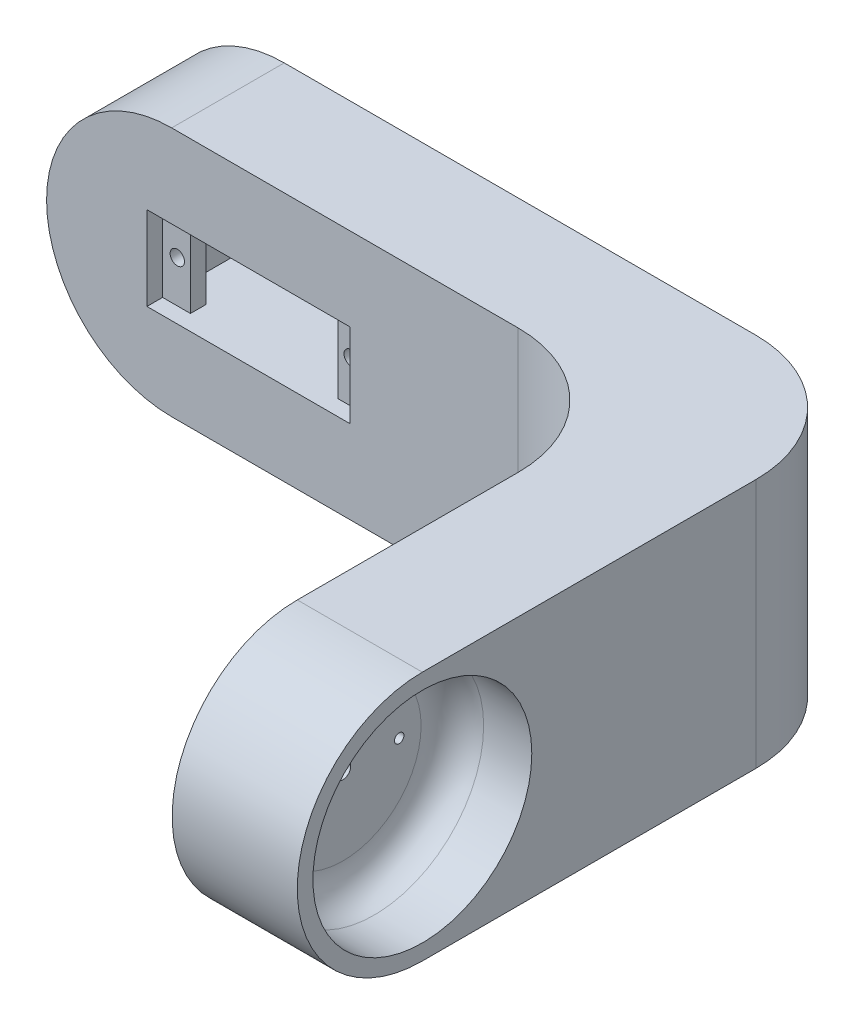
ISO-10303-21;
HEADER;
FILE_DESCRIPTION(('STEP AP214'),'2;1');
FILE_NAME('part.step','',(''),(''),'','','');
FILE_SCHEMA(('AUTOMOTIVE_DESIGN { 1 0 10303 214 1 1 1 1 }'));
ENDSEC;
DATA;
#1=APPLICATION_CONTEXT('core data for automotive mechanical design processes');
#2=APPLICATION_PROTOCOL_DEFINITION('international standard','automotive_design',2000,#1);
#3=PRODUCT_CONTEXT('',#1,'mechanical');
#4=PRODUCT('Part','Part','',(#3));
#5=PRODUCT_RELATED_PRODUCT_CATEGORY('part','',(#4));
#6=PRODUCT_DEFINITION_FORMATION('','',#4);
#7=PRODUCT_DEFINITION_CONTEXT('part definition',#1,'design');
#8=PRODUCT_DEFINITION('design','',#6,#7);
#9=PRODUCT_DEFINITION_SHAPE('','',#8);
#10=(LENGTH_UNIT() NAMED_UNIT(*) SI_UNIT(.MILLI.,.METRE.));
#11=(NAMED_UNIT(*) PLANE_ANGLE_UNIT() SI_UNIT($,.RADIAN.));
#12=(NAMED_UNIT(*) SI_UNIT($,.STERADIAN.) SOLID_ANGLE_UNIT());
#13=UNCERTAINTY_MEASURE_WITH_UNIT(LENGTH_MEASURE(1.E-05),#10,'distance_accuracy_value','');
#14=(GEOMETRIC_REPRESENTATION_CONTEXT(3) GLOBAL_UNCERTAINTY_ASSIGNED_CONTEXT((#13)) GLOBAL_UNIT_ASSIGNED_CONTEXT((#10,
#11,#12)) REPRESENTATION_CONTEXT('',''));
#15=CARTESIAN_POINT('',(0.,0.,0.));
#16=DIRECTION('',(0.,0.,1.));
#17=DIRECTION('',(1.,0.,0.));
#18=AXIS2_PLACEMENT_3D('',#15,#16,#17);
#19=CARTESIAN_POINT('',(0.,0.,-57.82));
#20=DIRECTION('',(0.,0.,1.));
#21=DIRECTION('',(1.,0.,0.));
#22=AXIS2_PLACEMENT_3D('',#19,#20,#21);
#23=PLANE('',#22);
#24=DIRECTION('',(0.,-1.,0.));
#25=VECTOR('',#24,1.);
#26=CARTESIAN_POINT('',(-74.9,6.7,-57.82));
#27=LINE('',#26,#25);
#28=CARTESIAN_POINT('',(-74.9,6.7,-57.82));
#29=VERTEX_POINT('',#28);
#30=CARTESIAN_POINT('',(-74.9,-6.7,-57.82));
#31=VERTEX_POINT('',#30);
#32=EDGE_CURVE('E207',#29,#31,#27,.T.);
#33=ORIENTED_EDGE('',*,*,#32,.F.);
#34=DIRECTION('',(-1.,0.,0.));
#35=VECTOR('',#34,1.);
#36=CARTESIAN_POINT('',(-79.35,6.7,-57.82));
#37=LINE('',#36,#35);
#38=CARTESIAN_POINT('',(-79.35,6.7,-57.82));
#39=VERTEX_POINT('',#38);
#40=EDGE_CURVE('E226',#29,#39,#37,.T.);
#41=ORIENTED_EDGE('',*,*,#40,.T.);
#42=DIRECTION('',(0.,-1.,0.));
#43=VECTOR('',#42,1.);
#44=CARTESIAN_POINT('',(-79.35,6.7,-57.82));
#45=LINE('',#44,#43);
#46=CARTESIAN_POINT('',(-79.35,-6.7,-57.82));
#47=VERTEX_POINT('',#46);
#48=EDGE_CURVE('E218',#39,#47,#45,.T.);
#49=ORIENTED_EDGE('',*,*,#48,.T.);
#50=DIRECTION('',(1.,0.,0.));
#51=VECTOR('',#50,1.);
#52=CARTESIAN_POINT('',(-79.35,-6.7,-57.82));
#53=LINE('',#52,#51);
#54=EDGE_CURVE('E197',#47,#31,#53,.T.);
#55=ORIENTED_EDGE('',*,*,#54,.T.);
#56=EDGE_LOOP('',(#33,#41,#49,#55));
#57=FACE_BOUND('',#56,.T.);
#58=CARTESIAN_POINT('',(-77.,0.,-57.82));
#59=DIRECTION('',(0.,0.,1.));
#60=DIRECTION('',(1.,0.,0.));
#61=AXIS2_PLACEMENT_3D('',#58,#59,#60);
#62=CIRCLE('',#61,1.15);
#63=CARTESIAN_POINT('',(-75.85,0.,-57.82));
#64=VERTEX_POINT('',#63);
#65=EDGE_CURVE('E214',#64,#64,#62,.T.);
#66=ORIENTED_EDGE('',*,*,#65,.F.);
#67=EDGE_LOOP('',(#66));
#68=FACE_BOUND('',#67,.T.);
#69=ADVANCED_FACE('F47',(#57,#68),#23,.T.);
#70=CARTESIAN_POINT('',(0.,0.,-60.32));
#71=DIRECTION('',(0.,0.,-1.));
#72=DIRECTION('',(-1.,0.,0.));
#73=AXIS2_PLACEMENT_3D('',#70,#71,#72);
#74=PLANE('',#73);
#75=CARTESIAN_POINT('',(-77.,0.,-60.32));
#76=DIRECTION('',(0.,0.,-1.));
#77=DIRECTION('',(-1.,0.,0.));
#78=AXIS2_PLACEMENT_3D('',#75,#76,#77);
#79=CIRCLE('',#78,1.15);
#80=CARTESIAN_POINT('',(-75.85,0.,-60.32));
#81=VERTEX_POINT('',#80);
#82=EDGE_CURVE('E400',#81,#81,#79,.T.);
#83=ORIENTED_EDGE('',*,*,#82,.F.);
#84=EDGE_LOOP('',(#83));
#85=FACE_BOUND('',#84,.T.);
#86=DIRECTION('',(0.,1.,0.));
#87=VECTOR('',#86,1.);
#88=CARTESIAN_POINT('',(-74.9,0.,-60.32));
#89=LINE('',#88,#87);
#90=CARTESIAN_POINT('',(-74.9,-6.7,-60.32));
#91=VERTEX_POINT('',#90);
#92=CARTESIAN_POINT('',(-74.9,6.7,-60.32));
#93=VERTEX_POINT('',#92);
#94=EDGE_CURVE('E11',#91,#93,#89,.T.);
#95=ORIENTED_EDGE('',*,*,#94,.F.);
#96=DIRECTION('',(-1.,0.,0.));
#97=VECTOR('',#96,1.);
#98=CARTESIAN_POINT('',(-46.85,-6.7,-60.32));
#99=LINE('',#98,#97);
#100=CARTESIAN_POINT('',(-79.35,-6.7,-60.32));
#101=VERTEX_POINT('',#100);
#102=EDGE_CURVE('E200',#91,#101,#99,.T.);
#103=ORIENTED_EDGE('',*,*,#102,.T.);
#104=DIRECTION('',(0.,1.,0.));
#105=VECTOR('',#104,1.);
#106=CARTESIAN_POINT('',(-79.35,6.7,-60.32));
#107=LINE('',#106,#105);
#108=CARTESIAN_POINT('',(-79.35,6.7,-60.32));
#109=VERTEX_POINT('',#108);
#110=EDGE_CURVE('E426',#101,#109,#107,.T.);
#111=ORIENTED_EDGE('',*,*,#110,.T.);
#112=DIRECTION('',(1.,0.,0.));
#113=VECTOR('',#112,1.);
#114=CARTESIAN_POINT('',(-46.85,6.7,-60.32));
#115=LINE('',#114,#113);
#116=EDGE_CURVE('E431',#109,#93,#115,.T.);
#117=ORIENTED_EDGE('',*,*,#116,.T.);
#118=EDGE_LOOP('',(#95,#103,#111,#117));
#119=FACE_BOUND('',#118,.T.);
#120=ADVANCED_FACE('F472',(#85,#119),#74,.T.);
#121=CARTESIAN_POINT('',(0.,0.,0.));
#122=DIRECTION('',(1.,0.,0.));
#123=DIRECTION('',(0.,0.,-1.));
#124=AXIS2_PLACEMENT_3D('',#121,#122,#123);
#125=PLANE('',#124);
#126=CARTESIAN_POINT('',(0.,0.,0.));
#127=DIRECTION('',(-1.,0.,0.));
#128=DIRECTION('',(0.,0.,1.));
#129=AXIS2_PLACEMENT_3D('',#126,#127,#128);
#130=CIRCLE('',#129,17.5);
#131=CARTESIAN_POINT('',(0.,0.,17.5));
#132=VERTEX_POINT('',#131);
#133=EDGE_CURVE('E295',#132,#132,#130,.T.);
#134=ORIENTED_EDGE('',*,*,#133,.F.);
#135=EDGE_LOOP('',(#134));
#136=FACE_BOUND('',#135,.T.);
#137=DIRECTION('',(0.,0.,-1.));
#138=VECTOR('',#137,1.);
#139=CARTESIAN_POINT('',(0.,20.,0.));
#140=LINE('',#139,#138);
#141=CARTESIAN_POINT('',(0.,20.,0.));
#142=VERTEX_POINT('',#141);
#143=CARTESIAN_POINT('',(0.,20.,-35.32));
#144=VERTEX_POINT('',#143);
#145=EDGE_CURVE('E303',#142,#144,#140,.T.);
#146=ORIENTED_EDGE('',*,*,#145,.T.);
#147=DIRECTION('',(0.,1.,0.));
#148=VECTOR('',#147,1.);
#149=CARTESIAN_POINT('',(0.,-20.,-35.32));
#150=LINE('',#149,#148);
#151=CARTESIAN_POINT('',(0.,-20.,-35.32));
#152=VERTEX_POINT('',#151);
#153=EDGE_CURVE('E390',#144,#152,#150,.F.);
#154=ORIENTED_EDGE('',*,*,#153,.T.);
#155=DIRECTION('',(0.,0.,-1.));
#156=VECTOR('',#155,1.);
#157=CARTESIAN_POINT('',(0.,-20.,0.));
#158=LINE('',#157,#156);
#159=CARTESIAN_POINT('',(0.,-20.,0.));
#160=VERTEX_POINT('',#159);
#161=EDGE_CURVE('E309',#160,#152,#158,.T.);
#162=ORIENTED_EDGE('',*,*,#161,.F.);
#163=CARTESIAN_POINT('',(0.,0.,0.));
#164=DIRECTION('',(1.,0.,0.));
#165=DIRECTION('',(0.,0.,-1.));
#166=AXIS2_PLACEMENT_3D('',#163,#164,#165);
#167=CIRCLE('',#166,20.);
#168=EDGE_CURVE('E320',#142,#160,#167,.T.);
#169=ORIENTED_EDGE('',*,*,#168,.F.);
#170=EDGE_LOOP('',(#146,#154,#162,#169));
#171=FACE_BOUND('',#170,.T.);
#172=ADVANCED_FACE('F525',(#136,#171),#125,.F.);
#173=CARTESIAN_POINT('',(20.,20.,0.));
#174=DIRECTION('',(0.,1.,0.));
#175=DIRECTION('',(0.,0.,1.));
#176=AXIS2_PLACEMENT_3D('',#173,#174,#175);
#177=PLANE('',#176);
#178=DIRECTION('',(0.,0.,-1.));
#179=VECTOR('',#178,1.);
#180=CARTESIAN_POINT('',(20.,20.,0.));
#181=LINE('',#180,#179);
#182=CARTESIAN_POINT('',(20.,20.,0.));
#183=VERTEX_POINT('',#182);
#184=CARTESIAN_POINT('',(20.,20.,-53.32));
#185=VERTEX_POINT('',#184);
#186=EDGE_CURVE('E304',#183,#185,#181,.T.);
#187=ORIENTED_EDGE('',*,*,#186,.T.);
#188=CARTESIAN_POINT('',(0.,20.,-53.32));
#189=DIRECTION('',(0.,1.,0.));
#190=DIRECTION('',(0.,0.,1.));
#191=AXIS2_PLACEMENT_3D('',#188,#189,#190);
#192=CIRCLE('',#191,20.);
#193=CARTESIAN_POINT('',(0.,20.,-73.32));
#194=VERTEX_POINT('',#193);
#195=EDGE_CURVE('E383',#185,#194,#192,.T.);
#196=ORIENTED_EDGE('',*,*,#195,.T.);
#197=DIRECTION('',(-1.,0.,0.));
#198=VECTOR('',#197,1.);
#199=CARTESIAN_POINT('',(20.,20.,-73.32));
#200=LINE('',#199,#198);
#201=CARTESIAN_POINT('',(-75.4,20.,-73.32));
#202=VERTEX_POINT('',#201);
#203=EDGE_CURVE('E316',#194,#202,#200,.T.);
#204=ORIENTED_EDGE('',*,*,#203,.T.);
#205=DIRECTION('',(0.,0.,-1.));
#206=VECTOR('',#205,1.);
#207=CARTESIAN_POINT('',(-75.4,20.,0.));
#208=LINE('',#207,#206);
#209=CARTESIAN_POINT('',(-75.4,20.,-55.32));
#210=VERTEX_POINT('',#209);
#211=EDGE_CURVE('E355',#202,#210,#208,.F.);
#212=ORIENTED_EDGE('',*,*,#211,.T.);
#213=DIRECTION('',(1.,0.,0.));
#214=VECTOR('',#213,1.);
#215=CARTESIAN_POINT('',(-95.4,20.,-55.32));
#216=LINE('',#215,#214);
#217=CARTESIAN_POINT('',(-20.,20.,-55.32));
#218=VERTEX_POINT('',#217);
#219=EDGE_CURVE('E263',#210,#218,#216,.T.);
#220=ORIENTED_EDGE('',*,*,#219,.T.);
#221=CARTESIAN_POINT('',(-20.,20.,-35.32));
#222=DIRECTION('',(0.,1.,0.));
#223=DIRECTION('',(0.,0.,1.));
#224=AXIS2_PLACEMENT_3D('',#221,#222,#223);
#225=CIRCLE('',#224,20.);
#226=EDGE_CURVE('E393',#218,#144,#225,.F.);
#227=ORIENTED_EDGE('',*,*,#226,.T.);
#228=ORIENTED_EDGE('',*,*,#145,.F.);
#229=DIRECTION('',(-1.,0.,0.));
#230=VECTOR('',#229,1.);
#231=CARTESIAN_POINT('',(20.,20.,0.));
#232=LINE('',#231,#230);
#233=EDGE_CURVE('E335',#183,#142,#232,.T.);
#234=ORIENTED_EDGE('',*,*,#233,.F.);
#235=EDGE_LOOP('',(#187,#196,#204,#212,#220,#227,#228,#234));
#236=FACE_BOUND('',#235,.T.);
#237=ADVANCED_FACE('F533',(#236),#177,.T.);
#238=CARTESIAN_POINT('',(20.,0.,0.));
#239=DIRECTION('',(-1.,0.,0.));
#240=DIRECTION('',(0.,0.,1.));
#241=AXIS2_PLACEMENT_3D('',#238,#239,#240);
#242=CYLINDRICAL_SURFACE('',#241,20.);
#243=ORIENTED_EDGE('',*,*,#168,.T.);
#244=DIRECTION('',(-1.,0.,0.));
#245=VECTOR('',#244,1.);
#246=CARTESIAN_POINT('',(20.,-20.,0.));
#247=LINE('',#246,#245);
#248=CARTESIAN_POINT('',(20.,-20.,0.));
#249=VERTEX_POINT('',#248);
#250=EDGE_CURVE('E331',#249,#160,#247,.T.);
#251=ORIENTED_EDGE('',*,*,#250,.F.);
#252=CARTESIAN_POINT('',(20.,0.,0.));
#253=DIRECTION('',(1.,0.,0.));
#254=DIRECTION('',(0.,0.,-1.));
#255=AXIS2_PLACEMENT_3D('',#252,#253,#254);
#256=CIRCLE('',#255,20.);
#257=EDGE_CURVE('E308',#183,#249,#256,.T.);
#258=ORIENTED_EDGE('',*,*,#257,.F.);
#259=ORIENTED_EDGE('',*,*,#233,.T.);
#260=EDGE_LOOP('',(#243,#251,#258,#259));
#261=FACE_BOUND('',#260,.T.);
#262=ADVANCED_FACE('F593',(#261),#242,.T.);
#263=CARTESIAN_POINT('',(20.,-20.,0.));
#264=DIRECTION('',(0.,1.,0.));
#265=DIRECTION('',(0.,0.,1.));
#266=AXIS2_PLACEMENT_3D('',#263,#264,#265);
#267=PLANE('',#266);
#268=DIRECTION('',(-1.,0.,0.));
#269=VECTOR('',#268,1.);
#270=CARTESIAN_POINT('',(20.,-20.,-73.32));
#271=LINE('',#270,#269);
#272=CARTESIAN_POINT('',(0.,-20.,-73.32));
#273=VERTEX_POINT('',#272);
#274=CARTESIAN_POINT('',(-75.4,-20.,-73.32));
#275=VERTEX_POINT('',#274);
#276=EDGE_CURVE('E328',#273,#275,#271,.T.);
#277=ORIENTED_EDGE('',*,*,#276,.F.);
#278=CARTESIAN_POINT('',(0.,-20.,-53.32));
#279=DIRECTION('',(0.,1.,0.));
#280=DIRECTION('',(0.,0.,1.));
#281=AXIS2_PLACEMENT_3D('',#278,#279,#280);
#282=CIRCLE('',#281,20.);
#283=CARTESIAN_POINT('',(20.,-20.,-53.32));
#284=VERTEX_POINT('',#283);
#285=EDGE_CURVE('E377',#273,#284,#282,.F.);
#286=ORIENTED_EDGE('',*,*,#285,.T.);
#287=DIRECTION('',(0.,0.,-1.));
#288=VECTOR('',#287,1.);
#289=CARTESIAN_POINT('',(20.,-20.,0.));
#290=LINE('',#289,#288);
#291=EDGE_CURVE('E312',#249,#284,#290,.T.);
#292=ORIENTED_EDGE('',*,*,#291,.F.);
#293=ORIENTED_EDGE('',*,*,#250,.T.);
#294=ORIENTED_EDGE('',*,*,#161,.T.);
#295=CARTESIAN_POINT('',(-20.,-20.,-35.32));
#296=DIRECTION('',(0.,1.,0.));
#297=DIRECTION('',(0.,0.,1.));
#298=AXIS2_PLACEMENT_3D('',#295,#296,#297);
#299=CIRCLE('',#298,20.);
#300=CARTESIAN_POINT('',(-20.,-20.,-55.32));
#301=VERTEX_POINT('',#300);
#302=EDGE_CURVE('E396',#152,#301,#299,.T.);
#303=ORIENTED_EDGE('',*,*,#302,.T.);
#304=DIRECTION('',(1.,0.,0.));
#305=VECTOR('',#304,1.);
#306=CARTESIAN_POINT('',(-95.4,-20.,-55.32));
#307=LINE('',#306,#305);
#308=CARTESIAN_POINT('',(-75.4,-20.,-55.32));
#309=VERTEX_POINT('',#308);
#310=EDGE_CURVE('E267',#309,#301,#307,.T.);
#311=ORIENTED_EDGE('',*,*,#310,.F.);
#312=DIRECTION('',(0.,0.,1.));
#313=VECTOR('',#312,1.);
#314=CARTESIAN_POINT('',(-75.4,-20.,-73.32));
#315=LINE('',#314,#313);
#316=EDGE_CURVE('E344',#309,#275,#315,.F.);
#317=ORIENTED_EDGE('',*,*,#316,.T.);
#318=EDGE_LOOP('',(#277,#286,#292,#293,#294,#303,#311,#317));
#319=FACE_BOUND('',#318,.T.);
#320=ADVANCED_FACE('F568',(#319),#267,.F.);
#321=CARTESIAN_POINT('',(20.,0.,-73.32));
#322=DIRECTION('',(0.,0.,-1.));
#323=DIRECTION('',(-1.,0.,0.));
#324=AXIS2_PLACEMENT_3D('',#321,#322,#323);
#325=PLANE('',#324);
#326=DIRECTION('',(0.,-1.,0.));
#327=VECTOR('',#326,1.);
#328=CARTESIAN_POINT('',(-46.85,6.7,-73.32));
#329=LINE('',#328,#327);
#330=CARTESIAN_POINT('',(-46.85,6.7,-73.32));
#331=VERTEX_POINT('',#330);
#332=CARTESIAN_POINT('',(-46.85,-6.7,-73.32));
#333=VERTEX_POINT('',#332);
#334=EDGE_CURVE('E408',#331,#333,#329,.T.);
#335=ORIENTED_EDGE('',*,*,#334,.F.);
#336=DIRECTION('',(1.,0.,0.));
#337=VECTOR('',#336,1.);
#338=CARTESIAN_POINT('',(-46.85,6.7,-73.32));
#339=LINE('',#338,#337);
#340=CARTESIAN_POINT('',(-79.35,6.7,-73.32));
#341=VERTEX_POINT('',#340);
#342=EDGE_CURVE('E421',#341,#331,#339,.T.);
#343=ORIENTED_EDGE('',*,*,#342,.F.);
#344=DIRECTION('',(0.,1.,0.));
#345=VECTOR('',#344,1.);
#346=CARTESIAN_POINT('',(-79.35,6.7,-73.32));
#347=LINE('',#346,#345);
#348=CARTESIAN_POINT('',(-79.35,-6.7,-73.32));
#349=VERTEX_POINT('',#348);
#350=EDGE_CURVE('E442',#349,#341,#347,.T.);
#351=ORIENTED_EDGE('',*,*,#350,.F.);
#352=DIRECTION('',(-1.,0.,0.));
#353=VECTOR('',#352,1.);
#354=CARTESIAN_POINT('',(-46.85,-6.7,-73.32));
#355=LINE('',#354,#353);
#356=EDGE_CURVE('E438',#333,#349,#355,.T.);
#357=ORIENTED_EDGE('',*,*,#356,.F.);
#358=EDGE_LOOP('',(#335,#343,#351,#357));
#359=FACE_BOUND('',#358,.T.);
#360=ORIENTED_EDGE('',*,*,#203,.F.);
#361=DIRECTION('',(0.,-1.,0.));
#362=VECTOR('',#361,1.);
#363=CARTESIAN_POINT('',(0.,0.,-73.32));
#364=LINE('',#363,#362);
#365=EDGE_CURVE('E373',#194,#273,#364,.T.);
#366=ORIENTED_EDGE('',*,*,#365,.T.);
#367=ORIENTED_EDGE('',*,*,#276,.T.);
#368=CARTESIAN_POINT('',(-75.4,0.,-73.32));
#369=DIRECTION('',(0.,0.,-1.));
#370=DIRECTION('',(-1.,0.,0.));
#371=AXIS2_PLACEMENT_3D('',#368,#369,#370);
#372=CIRCLE('',#371,20.);
#373=CARTESIAN_POINT('',(-95.4,0.,-73.32));
#374=VERTEX_POINT('',#373);
#375=EDGE_CURVE('E352',#275,#374,#372,.T.);
#376=ORIENTED_EDGE('',*,*,#375,.T.);
#377=CARTESIAN_POINT('',(-75.4,0.,-73.32));
#378=DIRECTION('',(0.,0.,-1.));
#379=DIRECTION('',(-1.,0.,0.));
#380=AXIS2_PLACEMENT_3D('',#377,#378,#379);
#381=CIRCLE('',#380,20.);
#382=EDGE_CURVE('E348',#374,#202,#381,.T.);
#383=ORIENTED_EDGE('',*,*,#382,.T.);
#384=EDGE_LOOP('',(#360,#366,#367,#376,#383));
#385=FACE_BOUND('',#384,.T.);
#386=ADVANCED_FACE('F464',(#359,#385),#325,.T.);
#387=CARTESIAN_POINT('',(20.,0.,0.));
#388=DIRECTION('',(1.,0.,0.));
#389=DIRECTION('',(0.,0.,-1.));
#390=AXIS2_PLACEMENT_3D('',#387,#388,#389);
#391=PLANE('',#390);
#392=CARTESIAN_POINT('',(20.,0.,0.));
#393=DIRECTION('',(1.,0.,0.));
#394=DIRECTION('',(0.,0.,-1.));
#395=AXIS2_PLACEMENT_3D('',#392,#393,#394);
#396=CIRCLE('',#395,17.5);
#397=CARTESIAN_POINT('',(20.,0.,-17.5));
#398=VERTEX_POINT('',#397);
#399=EDGE_CURVE('E299',#398,#398,#396,.T.);
#400=ORIENTED_EDGE('',*,*,#399,.F.);
#401=EDGE_LOOP('',(#400));
#402=FACE_BOUND('',#401,.T.);
#403=ORIENTED_EDGE('',*,*,#291,.T.);
#404=DIRECTION('',(0.,-1.,0.));
#405=VECTOR('',#404,1.);
#406=CARTESIAN_POINT('',(20.,0.,-53.32));
#407=LINE('',#406,#405);
#408=EDGE_CURVE('E380',#284,#185,#407,.F.);
#409=ORIENTED_EDGE('',*,*,#408,.T.);
#410=ORIENTED_EDGE('',*,*,#186,.F.);
#411=ORIENTED_EDGE('',*,*,#257,.T.);
#412=EDGE_LOOP('',(#403,#409,#410,#411));
#413=FACE_BOUND('',#412,.T.);
#414=ADVANCED_FACE('F586',(#402,#413),#391,.T.);
#415=CARTESIAN_POINT('',(7.3,0.,0.));
#416=DIRECTION('',(1.,0.,0.));
#417=DIRECTION('',(0.,0.,-1.));
#418=AXIS2_PLACEMENT_3D('',#415,#416,#417);
#419=CYLINDRICAL_SURFACE('',#418,17.5);
#420=CARTESIAN_POINT('',(12.3,0.,0.));
#421=DIRECTION('',(1.,0.,0.));
#422=DIRECTION('',(0.,0.,-1.));
#423=AXIS2_PLACEMENT_3D('',#420,#421,#422);
#424=CIRCLE('',#423,17.5);
#425=CARTESIAN_POINT('',(12.3,0.,-17.5));
#426=VERTEX_POINT('',#425);
#427=EDGE_CURVE('E369',#426,#426,#424,.F.);
#428=ORIENTED_EDGE('',*,*,#427,.T.);
#429=EDGE_LOOP('',(#428));
#430=FACE_BOUND('',#429,.T.);
#431=ORIENTED_EDGE('',*,*,#399,.T.);
#432=EDGE_LOOP('',(#431));
#433=FACE_BOUND('',#432,.T.);
#434=ADVANCED_FACE('F624',(#430,#433),#419,.F.);
#435=CARTESIAN_POINT('',(7.3,0.,0.));
#436=DIRECTION('',(1.,0.,0.));
#437=DIRECTION('',(0.,0.,-1.));
#438=AXIS2_PLACEMENT_3D('',#435,#436,#437);
#439=PLANE('',#438);
#440=CARTESIAN_POINT('',(7.3,0.,0.));
#441=DIRECTION('',(1.,0.,0.));
#442=DIRECTION('',(0.,0.,-1.));
#443=AXIS2_PLACEMENT_3D('',#440,#441,#442);
#444=CIRCLE('',#443,12.5);
#445=CARTESIAN_POINT('',(7.3,0.,-12.5));
#446=VERTEX_POINT('',#445);
#447=EDGE_CURVE('E365',#446,#446,#444,.T.);
#448=ORIENTED_EDGE('',*,*,#447,.T.);
#449=EDGE_LOOP('',(#448));
#450=FACE_BOUND('',#449,.T.);
#451=CARTESIAN_POINT('',(7.3,0.,9.));
#452=DIRECTION('',(1.,0.,0.));
#453=DIRECTION('',(0.,0.,-1.));
#454=AXIS2_PLACEMENT_3D('',#451,#452,#453);
#455=CIRCLE('',#454,0.75);
#456=CARTESIAN_POINT('',(7.3,0.,8.25));
#457=VERTEX_POINT('',#456);
#458=EDGE_CURVE('E291',#457,#457,#455,.T.);
#459=ORIENTED_EDGE('',*,*,#458,.F.);
#460=EDGE_LOOP('',(#459));
#461=FACE_BOUND('',#460,.T.);
#462=CARTESIAN_POINT('',(7.3,0.,-9.));
#463=DIRECTION('',(1.,0.,0.));
#464=DIRECTION('',(0.,0.,-1.));
#465=AXIS2_PLACEMENT_3D('',#462,#463,#464);
#466=CIRCLE('',#465,0.75);
#467=CARTESIAN_POINT('',(7.3,0.,-9.75));
#468=VERTEX_POINT('',#467);
#469=EDGE_CURVE('E287',#468,#468,#466,.T.);
#470=ORIENTED_EDGE('',*,*,#469,.F.);
#471=EDGE_LOOP('',(#470));
#472=FACE_BOUND('',#471,.T.);
#473=CARTESIAN_POINT('',(7.3,0.,0.));
#474=DIRECTION('',(1.,0.,0.));
#475=DIRECTION('',(0.,0.,-1.));
#476=AXIS2_PLACEMENT_3D('',#473,#474,#475);
#477=CIRCLE('',#476,1.25);
#478=CARTESIAN_POINT('',(7.3,0.,-1.25));
#479=VERTEX_POINT('',#478);
#480=EDGE_CURVE('E283',#479,#479,#477,.T.);
#481=ORIENTED_EDGE('',*,*,#480,.F.);
#482=EDGE_LOOP('',(#481));
#483=FACE_BOUND('',#482,.T.);
#484=ADVANCED_FACE('F620',(#450,#461,#472,#483),#439,.T.);
#485=CARTESIAN_POINT('',(4.8,0.,0.));
#486=DIRECTION('',(-1.,0.,0.));
#487=DIRECTION('',(0.,0.,1.));
#488=AXIS2_PLACEMENT_3D('',#485,#486,#487);
#489=PLANE('',#488);
#490=CARTESIAN_POINT('',(4.8,0.,0.));
#491=DIRECTION('',(-1.,0.,0.));
#492=DIRECTION('',(0.,0.,1.));
#493=AXIS2_PLACEMENT_3D('',#490,#491,#492);
#494=CIRCLE('',#493,12.5040016012813);
#495=CARTESIAN_POINT('',(4.8,0.,12.5040016012813));
#496=VERTEX_POINT('',#495);
#497=EDGE_CURVE('E358',#496,#496,#494,.T.);
#498=ORIENTED_EDGE('',*,*,#497,.T.);
#499=EDGE_LOOP('',(#498));
#500=FACE_BOUND('',#499,.T.);
#501=CARTESIAN_POINT('',(4.8,0.,9.));
#502=DIRECTION('',(-1.,0.,0.));
#503=DIRECTION('',(0.,0.,1.));
#504=AXIS2_PLACEMENT_3D('',#501,#502,#503);
#505=CIRCLE('',#504,0.75);
#506=CARTESIAN_POINT('',(4.8,0.,9.75));
#507=VERTEX_POINT('',#506);
#508=EDGE_CURVE('E271',#507,#507,#505,.T.);
#509=ORIENTED_EDGE('',*,*,#508,.F.);
#510=EDGE_LOOP('',(#509));
#511=FACE_BOUND('',#510,.T.);
#512=CARTESIAN_POINT('',(4.8,0.,-9.));
#513=DIRECTION('',(-1.,0.,0.));
#514=DIRECTION('',(0.,0.,1.));
#515=AXIS2_PLACEMENT_3D('',#512,#513,#514);
#516=CIRCLE('',#515,0.75);
#517=CARTESIAN_POINT('',(4.8,0.,-8.25));
#518=VERTEX_POINT('',#517);
#519=EDGE_CURVE('E272',#518,#518,#516,.T.);
#520=ORIENTED_EDGE('',*,*,#519,.F.);
#521=EDGE_LOOP('',(#520));
#522=FACE_BOUND('',#521,.T.);
#523=CARTESIAN_POINT('',(4.8,0.,0.));
#524=DIRECTION('',(-1.,0.,0.));
#525=DIRECTION('',(0.,0.,1.));
#526=AXIS2_PLACEMENT_3D('',#523,#524,#525);
#527=CIRCLE('',#526,1.25);
#528=CARTESIAN_POINT('',(4.8,0.,1.25));
#529=VERTEX_POINT('',#528);
#530=EDGE_CURVE('E276',#529,#529,#527,.T.);
#531=ORIENTED_EDGE('',*,*,#530,.F.);
#532=EDGE_LOOP('',(#531));
#533=FACE_BOUND('',#532,.T.);
#534=ADVANCED_FACE('F623',(#500,#511,#522,#533),#489,.T.);
#535=CARTESIAN_POINT('',(9.6,0.,0.));
#536=DIRECTION('',(-1.,0.,0.));
#537=DIRECTION('',(0.,0.,1.));
#538=AXIS2_PLACEMENT_3D('',#535,#536,#537);
#539=CYLINDRICAL_SURFACE('',#538,1.25);
#540=ORIENTED_EDGE('',*,*,#480,.T.);
#541=EDGE_LOOP('',(#540));
#542=FACE_BOUND('',#541,.T.);
#543=ORIENTED_EDGE('',*,*,#530,.T.);
#544=EDGE_LOOP('',(#543));
#545=FACE_BOUND('',#544,.T.);
#546=ADVANCED_FACE('F632',(#542,#545),#539,.F.);
#547=CARTESIAN_POINT('',(9.6,0.,-9.));
#548=DIRECTION('',(-1.,0.,0.));
#549=DIRECTION('',(0.,0.,1.));
#550=AXIS2_PLACEMENT_3D('',#547,#548,#549);
#551=CYLINDRICAL_SURFACE('',#550,0.75);
#552=ORIENTED_EDGE('',*,*,#469,.T.);
#553=EDGE_LOOP('',(#552));
#554=FACE_BOUND('',#553,.T.);
#555=ORIENTED_EDGE('',*,*,#519,.T.);
#556=EDGE_LOOP('',(#555));
#557=FACE_BOUND('',#556,.T.);
#558=ADVANCED_FACE('F634',(#554,#557),#551,.F.);
#559=CARTESIAN_POINT('',(9.6,0.,9.));
#560=DIRECTION('',(-1.,0.,0.));
#561=DIRECTION('',(0.,0.,1.));
#562=AXIS2_PLACEMENT_3D('',#559,#560,#561);
#563=CYLINDRICAL_SURFACE('',#562,0.75);
#564=ORIENTED_EDGE('',*,*,#458,.T.);
#565=EDGE_LOOP('',(#564));
#566=FACE_BOUND('',#565,.T.);
#567=ORIENTED_EDGE('',*,*,#508,.T.);
#568=EDGE_LOOP('',(#567));
#569=FACE_BOUND('',#568,.T.);
#570=ADVANCED_FACE('F671',(#566,#569),#563,.F.);
#571=CARTESIAN_POINT('',(-95.4,20.,-55.32));
#572=DIRECTION('',(0.,0.,-1.));
#573=DIRECTION('',(0.,1.,0.));
#574=AXIS2_PLACEMENT_3D('',#571,#572,#573);
#575=PLANE('',#574);
#576=DIRECTION('',(1.,0.,0.));
#577=VECTOR('',#576,1.);
#578=CARTESIAN_POINT('',(-79.35,-6.7,-55.32));
#579=LINE('',#578,#577);
#580=CARTESIAN_POINT('',(-79.35,-6.7,-55.32));
#581=VERTEX_POINT('',#580);
#582=CARTESIAN_POINT('',(-46.85,-6.7,-55.32));
#583=VERTEX_POINT('',#582);
#584=EDGE_CURVE('E239',#581,#583,#579,.T.);
#585=ORIENTED_EDGE('',*,*,#584,.F.);
#586=DIRECTION('',(0.,-1.,0.));
#587=VECTOR('',#586,1.);
#588=CARTESIAN_POINT('',(-79.35,6.7,-55.32));
#589=LINE('',#588,#587);
#590=CARTESIAN_POINT('',(-79.35,6.7,-55.32));
#591=VERTEX_POINT('',#590);
#592=EDGE_CURVE('E236',#591,#581,#589,.T.);
#593=ORIENTED_EDGE('',*,*,#592,.F.);
#594=DIRECTION('',(-1.,0.,0.));
#595=VECTOR('',#594,1.);
#596=CARTESIAN_POINT('',(-79.35,6.7,-55.32));
#597=LINE('',#596,#595);
#598=CARTESIAN_POINT('',(-46.85,6.7,-55.32));
#599=VERTEX_POINT('',#598);
#600=EDGE_CURVE('E247',#599,#591,#597,.T.);
#601=ORIENTED_EDGE('',*,*,#600,.F.);
#602=DIRECTION('',(0.,1.,0.));
#603=VECTOR('',#602,1.);
#604=CARTESIAN_POINT('',(-46.85,6.7,-55.32));
#605=LINE('',#604,#603);
#606=EDGE_CURVE('E243',#583,#599,#605,.T.);
#607=ORIENTED_EDGE('',*,*,#606,.F.);
#608=EDGE_LOOP('',(#585,#593,#601,#607));
#609=FACE_BOUND('',#608,.T.);
#610=ORIENTED_EDGE('',*,*,#310,.T.);
#611=DIRECTION('',(0.,1.,0.));
#612=VECTOR('',#611,1.);
#613=CARTESIAN_POINT('',(-20.,20.,-55.32));
#614=LINE('',#613,#612);
#615=EDGE_CURVE('E386',#301,#218,#614,.T.);
#616=ORIENTED_EDGE('',*,*,#615,.T.);
#617=ORIENTED_EDGE('',*,*,#219,.F.);
#618=CARTESIAN_POINT('',(-75.4,0.,-55.32));
#619=DIRECTION('',(0.,0.,-1.));
#620=DIRECTION('',(0.,1.,0.));
#621=AXIS2_PLACEMENT_3D('',#618,#619,#620);
#622=CIRCLE('',#621,20.);
#623=CARTESIAN_POINT('',(-95.4,0.,-55.32));
#624=VERTEX_POINT('',#623);
#625=EDGE_CURVE('E338',#210,#624,#622,.F.);
#626=ORIENTED_EDGE('',*,*,#625,.T.);
#627=CARTESIAN_POINT('',(-75.4,0.,-55.32));
#628=DIRECTION('',(0.,0.,-1.));
#629=DIRECTION('',(0.,1.,0.));
#630=AXIS2_PLACEMENT_3D('',#627,#628,#629);
#631=CIRCLE('',#630,20.);
#632=EDGE_CURVE('E341',#624,#309,#631,.F.);
#633=ORIENTED_EDGE('',*,*,#632,.T.);
#634=EDGE_LOOP('',(#610,#616,#617,#626,#633));
#635=FACE_BOUND('',#634,.T.);
#636=ADVANCED_FACE('F486',(#609,#635),#575,.F.);
#637=CARTESIAN_POINT('',(-75.4,0.,0.));
#638=DIRECTION('',(0.,0.,-1.));
#639=DIRECTION('',(-1.,0.,0.));
#640=AXIS2_PLACEMENT_3D('',#637,#638,#639);
#641=CYLINDRICAL_SURFACE('',#640,20.);
#642=ORIENTED_EDGE('',*,*,#211,.F.);
#643=ORIENTED_EDGE('',*,*,#382,.F.);
#644=DIRECTION('',(0.,0.,-1.));
#645=VECTOR('',#644,1.);
#646=CARTESIAN_POINT('',(-95.4,0.,0.));
#647=LINE('',#646,#645);
#648=EDGE_CURVE('E254',#624,#374,#647,.T.);
#649=ORIENTED_EDGE('',*,*,#648,.F.);
#650=ORIENTED_EDGE('',*,*,#625,.F.);
#651=EDGE_LOOP('',(#642,#643,#649,#650));
#652=FACE_BOUND('',#651,.T.);
#653=ADVANCED_FACE('F608',(#652),#641,.T.);
#654=CARTESIAN_POINT('',(-75.4,0.,0.));
#655=DIRECTION('',(0.,0.,-1.));
#656=DIRECTION('',(-1.,0.,0.));
#657=AXIS2_PLACEMENT_3D('',#654,#655,#656);
#658=CYLINDRICAL_SURFACE('',#657,20.);
#659=ORIENTED_EDGE('',*,*,#375,.F.);
#660=ORIENTED_EDGE('',*,*,#316,.F.);
#661=ORIENTED_EDGE('',*,*,#632,.F.);
#662=ORIENTED_EDGE('',*,*,#648,.T.);
#663=EDGE_LOOP('',(#659,#660,#661,#662));
#664=FACE_BOUND('',#663,.T.);
#665=ADVANCED_FACE('F577',(#664),#658,.T.);
#666=CARTESIAN_POINT('',(-79.35,6.7,-57.82));
#667=DIRECTION('',(-1.,0.,0.));
#668=DIRECTION('',(0.,0.,1.));
#669=AXIS2_PLACEMENT_3D('',#666,#667,#668);
#670=PLANE('',#669);
#671=ORIENTED_EDGE('',*,*,#592,.T.);
#672=DIRECTION('',(0.,0.,1.));
#673=VECTOR('',#672,1.);
#674=CARTESIAN_POINT('',(-79.35,-6.7,-57.82));
#675=LINE('',#674,#673);
#676=EDGE_CURVE('E235',#47,#581,#675,.T.);
#677=ORIENTED_EDGE('',*,*,#676,.F.);
#678=ORIENTED_EDGE('',*,*,#48,.F.);
#679=DIRECTION('',(0.,0.,1.));
#680=VECTOR('',#679,1.);
#681=CARTESIAN_POINT('',(-79.35,6.7,-57.82));
#682=LINE('',#681,#680);
#683=EDGE_CURVE('E251',#39,#591,#682,.T.);
#684=ORIENTED_EDGE('',*,*,#683,.T.);
#685=EDGE_LOOP('',(#671,#677,#678,#684));
#686=FACE_BOUND('',#685,.T.);
#687=ADVANCED_FACE('F480',(#686),#670,.F.);
#688=CARTESIAN_POINT('',(-79.35,6.7,-57.82));
#689=DIRECTION('',(0.,1.,0.));
#690=DIRECTION('',(0.,0.,1.));
#691=AXIS2_PLACEMENT_3D('',#688,#689,#690);
#692=PLANE('',#691);
#693=ORIENTED_EDGE('',*,*,#600,.T.);
#694=ORIENTED_EDGE('',*,*,#683,.F.);
#695=ORIENTED_EDGE('',*,*,#40,.F.);
#696=DIRECTION('',(0.,0.,1.));
#697=VECTOR('',#696,1.);
#698=CARTESIAN_POINT('',(-74.9,6.7,-70.82));
#699=LINE('',#698,#697);
#700=EDGE_CURVE('E210',#93,#29,#699,.T.);
#701=ORIENTED_EDGE('',*,*,#700,.F.);
#702=ORIENTED_EDGE('',*,*,#116,.F.);
#703=DIRECTION('',(0.,0.,-1.));
#704=VECTOR('',#703,1.);
#705=CARTESIAN_POINT('',(-79.35,6.7,-60.32));
#706=LINE('',#705,#704);
#707=EDGE_CURVE('E451',#109,#341,#706,.T.);
#708=ORIENTED_EDGE('',*,*,#707,.T.);
#709=ORIENTED_EDGE('',*,*,#342,.T.);
#710=DIRECTION('',(0.,0.,-1.));
#711=VECTOR('',#710,1.);
#712=CARTESIAN_POINT('',(-46.85,6.7,-60.32));
#713=LINE('',#712,#711);
#714=CARTESIAN_POINT('',(-46.85,6.7,-60.32));
#715=VERTEX_POINT('',#714);
#716=EDGE_CURVE('E240',#715,#331,#713,.T.);
#717=ORIENTED_EDGE('',*,*,#716,.F.);
#718=CARTESIAN_POINT('',(-51.3,6.7,-60.32));
#719=VERTEX_POINT('',#718);
#720=EDGE_CURVE('E430',#719,#715,#115,.T.);
#721=ORIENTED_EDGE('',*,*,#720,.F.);
#722=DIRECTION('',(0.,0.,1.));
#723=VECTOR('',#722,1.);
#724=CARTESIAN_POINT('',(-51.3,6.7,-70.82));
#725=LINE('',#724,#723);
#726=CARTESIAN_POINT('',(-51.3,6.7,-57.82));
#727=VERTEX_POINT('',#726);
#728=EDGE_CURVE('E409',#719,#727,#725,.T.);
#729=ORIENTED_EDGE('',*,*,#728,.T.);
#730=CARTESIAN_POINT('',(-46.85,6.7,-57.82));
#731=VERTEX_POINT('',#730);
#732=EDGE_CURVE('E231',#731,#727,#37,.T.);
#733=ORIENTED_EDGE('',*,*,#732,.F.);
#734=DIRECTION('',(0.,0.,1.));
#735=VECTOR('',#734,1.);
#736=CARTESIAN_POINT('',(-46.85,6.7,-57.82));
#737=LINE('',#736,#735);
#738=EDGE_CURVE('E255',#731,#599,#737,.T.);
#739=ORIENTED_EDGE('',*,*,#738,.T.);
#740=EDGE_LOOP('',(#693,#694,#695,#701,#702,#708,#709,#717,#721,#729,#733,#739));
#741=FACE_BOUND('',#740,.T.);
#742=ADVANCED_FACE('F474',(#741),#692,.F.);
#743=CARTESIAN_POINT('',(-46.85,6.7,-57.82));
#744=DIRECTION('',(1.,0.,0.));
#745=DIRECTION('',(0.,0.,-1.));
#746=AXIS2_PLACEMENT_3D('',#743,#744,#745);
#747=PLANE('',#746);
#748=ORIENTED_EDGE('',*,*,#606,.T.);
#749=ORIENTED_EDGE('',*,*,#738,.F.);
#750=DIRECTION('',(0.,1.,0.));
#751=VECTOR('',#750,1.);
#752=CARTESIAN_POINT('',(-46.85,6.7,-57.82));
#753=LINE('',#752,#751);
#754=CARTESIAN_POINT('',(-46.85,-6.7,-57.82));
#755=VERTEX_POINT('',#754);
#756=EDGE_CURVE('E220',#755,#731,#753,.T.);
#757=ORIENTED_EDGE('',*,*,#756,.F.);
#758=DIRECTION('',(0.,0.,1.));
#759=VECTOR('',#758,1.);
#760=CARTESIAN_POINT('',(-46.85,-6.7,-57.82));
#761=LINE('',#760,#759);
#762=EDGE_CURVE('E258',#755,#583,#761,.T.);
#763=ORIENTED_EDGE('',*,*,#762,.T.);
#764=EDGE_LOOP('',(#748,#749,#757,#763));
#765=FACE_BOUND('',#764,.T.);
#766=ADVANCED_FACE('F489',(#765),#747,.F.);
#767=CARTESIAN_POINT('',(-79.35,-6.7,-57.82));
#768=DIRECTION('',(0.,-1.,0.));
#769=DIRECTION('',(0.,0.,-1.));
#770=AXIS2_PLACEMENT_3D('',#767,#768,#769);
#771=PLANE('',#770);
#772=ORIENTED_EDGE('',*,*,#584,.T.);
#773=ORIENTED_EDGE('',*,*,#762,.F.);
#774=CARTESIAN_POINT('',(-51.3,-6.7,-57.82));
#775=VERTEX_POINT('',#774);
#776=EDGE_CURVE('E221',#775,#755,#53,.T.);
#777=ORIENTED_EDGE('',*,*,#776,.F.);
#778=DIRECTION('',(0.,0.,1.));
#779=VECTOR('',#778,1.);
#780=CARTESIAN_POINT('',(-51.3,-6.7,-70.82));
#781=LINE('',#780,#779);
#782=CARTESIAN_POINT('',(-51.3,-6.7,-60.32));
#783=VERTEX_POINT('',#782);
#784=EDGE_CURVE('E65',#783,#775,#781,.T.);
#785=ORIENTED_EDGE('',*,*,#784,.F.);
#786=CARTESIAN_POINT('',(-46.85,-6.7,-60.32));
#787=VERTEX_POINT('',#786);
#788=EDGE_CURVE('E422',#787,#783,#99,.T.);
#789=ORIENTED_EDGE('',*,*,#788,.F.);
#790=DIRECTION('',(0.,0.,-1.));
#791=VECTOR('',#790,1.);
#792=CARTESIAN_POINT('',(-46.85,-6.7,-60.32));
#793=LINE('',#792,#791);
#794=EDGE_CURVE('E435',#787,#333,#793,.T.);
#795=ORIENTED_EDGE('',*,*,#794,.T.);
#796=ORIENTED_EDGE('',*,*,#356,.T.);
#797=DIRECTION('',(0.,0.,-1.));
#798=VECTOR('',#797,1.);
#799=CARTESIAN_POINT('',(-79.35,-6.7,-60.32));
#800=LINE('',#799,#798);
#801=EDGE_CURVE('E454',#101,#349,#800,.T.);
#802=ORIENTED_EDGE('',*,*,#801,.F.);
#803=ORIENTED_EDGE('',*,*,#102,.F.);
#804=DIRECTION('',(0.,0.,1.));
#805=VECTOR('',#804,1.);
#806=CARTESIAN_POINT('',(-74.9,-6.7,-70.82));
#807=LINE('',#806,#805);
#808=EDGE_CURVE('E191',#91,#31,#807,.T.);
#809=ORIENTED_EDGE('',*,*,#808,.T.);
#810=ORIENTED_EDGE('',*,*,#54,.F.);
#811=ORIENTED_EDGE('',*,*,#676,.T.);
#812=EDGE_LOOP('',(#772,#773,#777,#785,#789,#795,#796,#802,#803,#809,#810,#811));
#813=FACE_BOUND('',#812,.T.);
#814=ADVANCED_FACE('F194',(#813),#771,.F.);
#815=DIRECTION('',(0.,1.,0.));
#816=VECTOR('',#815,1.);
#817=CARTESIAN_POINT('',(-51.3,6.7,-57.82));
#818=LINE('',#817,#816);
#819=EDGE_CURVE('E204',#775,#727,#818,.T.);
#820=ORIENTED_EDGE('',*,*,#819,.F.);
#821=ORIENTED_EDGE('',*,*,#776,.T.);
#822=ORIENTED_EDGE('',*,*,#756,.T.);
#823=ORIENTED_EDGE('',*,*,#732,.T.);
#824=EDGE_LOOP('',(#820,#821,#822,#823));
#825=FACE_BOUND('',#824,.T.);
#826=CARTESIAN_POINT('',(-49.2,0.,-57.82));
#827=DIRECTION('',(0.,0.,1.));
#828=DIRECTION('',(1.,0.,0.));
#829=AXIS2_PLACEMENT_3D('',#826,#827,#828);
#830=CIRCLE('',#829,1.15);
#831=CARTESIAN_POINT('',(-48.05,0.,-57.82));
#832=VERTEX_POINT('',#831);
#833=EDGE_CURVE('E499',#832,#832,#830,.T.);
#834=ORIENTED_EDGE('',*,*,#833,.F.);
#835=EDGE_LOOP('',(#834));
#836=FACE_BOUND('',#835,.T.);
#837=ADVANCED_FACE('F492',(#825,#836),#23,.T.);
#838=CARTESIAN_POINT('',(-0.2,0.,0.));
#839=DIRECTION('',(1.,0.,0.));
#840=DIRECTION('',(0.,0.,-1.));
#841=AXIS2_PLACEMENT_3D('',#838,#839,#840);
#842=TOROIDAL_SURFACE('',#841,12.5040016012813,5.);
#843=ORIENTED_EDGE('',*,*,#133,.T.);
#844=EDGE_LOOP('',(#843));
#845=FACE_BOUND('',#844,.T.);
#846=ORIENTED_EDGE('',*,*,#497,.F.);
#847=EDGE_LOOP('',(#846));
#848=FACE_BOUND('',#847,.T.);
#849=ADVANCED_FACE('F507',(#845,#848),#842,.F.);
#850=CARTESIAN_POINT('',(12.3,0.,0.));
#851=DIRECTION('',(1.,0.,0.));
#852=DIRECTION('',(0.,0.,-1.));
#853=AXIS2_PLACEMENT_3D('',#850,#851,#852);
#854=TOROIDAL_SURFACE('',#853,12.5,5.);
#855=ORIENTED_EDGE('',*,*,#427,.F.);
#856=EDGE_LOOP('',(#855));
#857=FACE_BOUND('',#856,.T.);
#858=ORIENTED_EDGE('',*,*,#447,.F.);
#859=EDGE_LOOP('',(#858));
#860=FACE_BOUND('',#859,.T.);
#861=ADVANCED_FACE('F514',(#857,#860),#854,.F.);
#862=CARTESIAN_POINT('',(0.,0.,-53.32));
#863=DIRECTION('',(0.,-1.,0.));
#864=DIRECTION('',(0.,0.,-1.));
#865=AXIS2_PLACEMENT_3D('',#862,#863,#864);
#866=CYLINDRICAL_SURFACE('',#865,20.);
#867=ORIENTED_EDGE('',*,*,#195,.F.);
#868=ORIENTED_EDGE('',*,*,#408,.F.);
#869=ORIENTED_EDGE('',*,*,#285,.F.);
#870=ORIENTED_EDGE('',*,*,#365,.F.);
#871=EDGE_LOOP('',(#867,#868,#869,#870));
#872=FACE_BOUND('',#871,.T.);
#873=ADVANCED_FACE('F556',(#872),#866,.T.);
#874=CARTESIAN_POINT('',(-20.,20.,-35.32));
#875=DIRECTION('',(0.,-1.,0.));
#876=DIRECTION('',(0.,0.,-1.));
#877=AXIS2_PLACEMENT_3D('',#874,#875,#876);
#878=CYLINDRICAL_SURFACE('',#877,20.);
#879=ORIENTED_EDGE('',*,*,#302,.F.);
#880=ORIENTED_EDGE('',*,*,#153,.F.);
#881=ORIENTED_EDGE('',*,*,#226,.F.);
#882=ORIENTED_EDGE('',*,*,#615,.F.);
#883=EDGE_LOOP('',(#879,#880,#881,#882));
#884=FACE_BOUND('',#883,.T.);
#885=ADVANCED_FACE('F49',(#884),#878,.F.);
#886=CARTESIAN_POINT('',(-46.85,6.7,-60.32));
#887=DIRECTION('',(1.,0.,0.));
#888=DIRECTION('',(0.,0.,-1.));
#889=AXIS2_PLACEMENT_3D('',#886,#887,#888);
#890=PLANE('',#889);
#891=ORIENTED_EDGE('',*,*,#334,.T.);
#892=ORIENTED_EDGE('',*,*,#794,.F.);
#893=DIRECTION('',(0.,-1.,0.));
#894=VECTOR('',#893,1.);
#895=CARTESIAN_POINT('',(-46.85,6.7,-60.32));
#896=LINE('',#895,#894);
#897=EDGE_CURVE('E417',#715,#787,#896,.T.);
#898=ORIENTED_EDGE('',*,*,#897,.F.);
#899=ORIENTED_EDGE('',*,*,#716,.T.);
#900=EDGE_LOOP('',(#891,#892,#898,#899));
#901=FACE_BOUND('',#900,.T.);
#902=ADVANCED_FACE('F543',(#901),#890,.F.);
#903=CARTESIAN_POINT('',(-79.35,6.7,-60.32));
#904=DIRECTION('',(-1.,0.,0.));
#905=DIRECTION('',(0.,0.,1.));
#906=AXIS2_PLACEMENT_3D('',#903,#904,#905);
#907=PLANE('',#906);
#908=ORIENTED_EDGE('',*,*,#350,.T.);
#909=ORIENTED_EDGE('',*,*,#707,.F.);
#910=ORIENTED_EDGE('',*,*,#110,.F.);
#911=ORIENTED_EDGE('',*,*,#801,.T.);
#912=EDGE_LOOP('',(#908,#909,#910,#911));
#913=FACE_BOUND('',#912,.T.);
#914=ADVANCED_FACE('F468',(#913),#907,.F.);
#915=CARTESIAN_POINT('',(-49.2,0.,-60.32));
#916=DIRECTION('',(0.,0.,-1.));
#917=DIRECTION('',(-1.,0.,0.));
#918=AXIS2_PLACEMENT_3D('',#915,#916,#917);
#919=CIRCLE('',#918,1.15);
#920=CARTESIAN_POINT('',(-48.05,0.,-60.32));
#921=VERTEX_POINT('',#920);
#922=EDGE_CURVE('E51',#921,#921,#919,.T.);
#923=ORIENTED_EDGE('',*,*,#922,.F.);
#924=EDGE_LOOP('',(#923));
#925=FACE_BOUND('',#924,.T.);
#926=DIRECTION('',(0.,-1.,0.));
#927=VECTOR('',#926,1.);
#928=CARTESIAN_POINT('',(-51.3,0.,-60.32));
#929=LINE('',#928,#927);
#930=EDGE_CURVE('E57',#719,#783,#929,.T.);
#931=ORIENTED_EDGE('',*,*,#930,.F.);
#932=ORIENTED_EDGE('',*,*,#720,.T.);
#933=ORIENTED_EDGE('',*,*,#897,.T.);
#934=ORIENTED_EDGE('',*,*,#788,.T.);
#935=EDGE_LOOP('',(#931,#932,#933,#934));
#936=FACE_BOUND('',#935,.T.);
#937=ADVANCED_FACE('F528',(#925,#936),#74,.T.);
#938=CARTESIAN_POINT('',(-74.9,6.7,-70.82));
#939=DIRECTION('',(-1.,0.,0.));
#940=DIRECTION('',(0.,0.,1.));
#941=AXIS2_PLACEMENT_3D('',#938,#939,#940);
#942=PLANE('',#941);
#943=ORIENTED_EDGE('',*,*,#94,.T.);
#944=ORIENTED_EDGE('',*,*,#700,.T.);
#945=ORIENTED_EDGE('',*,*,#32,.T.);
#946=ORIENTED_EDGE('',*,*,#808,.F.);
#947=EDGE_LOOP('',(#943,#944,#945,#946));
#948=FACE_BOUND('',#947,.T.);
#949=ADVANCED_FACE('F208',(#948),#942,.F.);
#950=CARTESIAN_POINT('',(-51.3,6.7,-70.82));
#951=DIRECTION('',(1.,0.,0.));
#952=DIRECTION('',(0.,0.,-1.));
#953=AXIS2_PLACEMENT_3D('',#950,#951,#952);
#954=PLANE('',#953);
#955=ORIENTED_EDGE('',*,*,#930,.T.);
#956=ORIENTED_EDGE('',*,*,#784,.T.);
#957=ORIENTED_EDGE('',*,*,#819,.T.);
#958=ORIENTED_EDGE('',*,*,#728,.F.);
#959=EDGE_LOOP('',(#955,#956,#957,#958));
#960=FACE_BOUND('',#959,.T.);
#961=ADVANCED_FACE('F542',(#960),#954,.F.);
#962=CARTESIAN_POINT('',(-77.,0.,-70.82));
#963=DIRECTION('',(0.,0.,1.));
#964=DIRECTION('',(1.,0.,0.));
#965=AXIS2_PLACEMENT_3D('',#962,#963,#964);
#966=CYLINDRICAL_SURFACE('',#965,1.15);
#967=CARTESIAN_POINT('',(-75.85,0.,-60.32));
#968=CARTESIAN_POINT('',(-75.85,0.,-60.2939583333333));
#969=CARTESIAN_POINT('',(-75.85,0.,-60.2679166666667));
#970=CARTESIAN_POINT('',(-75.85,0.,-60.2158333333333));
#971=CARTESIAN_POINT('',(-75.85,0.,-60.1897916666667));
#972=CARTESIAN_POINT('',(-75.85,0.,-60.1377083333333));
#973=CARTESIAN_POINT('',(-75.85,0.,-60.1116666666667));
#974=CARTESIAN_POINT('',(-75.85,0.,-60.0595833333333));
#975=CARTESIAN_POINT('',(-75.85,0.,-60.0335416666667));
#976=CARTESIAN_POINT('',(-75.85,0.,-59.9814583333333));
#977=CARTESIAN_POINT('',(-75.85,0.,-59.9554166666667));
#978=CARTESIAN_POINT('',(-75.85,0.,-59.9033333333333));
#979=CARTESIAN_POINT('',(-75.85,0.,-59.8772916666667));
#980=CARTESIAN_POINT('',(-75.85,0.,-59.8252083333333));
#981=CARTESIAN_POINT('',(-75.85,0.,-59.7991666666667));
#982=CARTESIAN_POINT('',(-75.85,0.,-59.7470833333333));
#983=CARTESIAN_POINT('',(-75.85,0.,-59.7210416666667));
#984=CARTESIAN_POINT('',(-75.85,0.,-59.6689583333333));
#985=CARTESIAN_POINT('',(-75.85,0.,-59.6429166666667));
#986=CARTESIAN_POINT('',(-75.85,0.,-59.5908333333333));
#987=CARTESIAN_POINT('',(-75.85,0.,-59.5647916666667));
#988=CARTESIAN_POINT('',(-75.85,0.,-59.5127083333333));
#989=CARTESIAN_POINT('',(-75.85,0.,-59.4866666666667));
#990=CARTESIAN_POINT('',(-75.85,0.,-59.4345833333333));
#991=CARTESIAN_POINT('',(-75.85,0.,-59.4085416666667));
#992=CARTESIAN_POINT('',(-75.85,0.,-59.3564583333333));
#993=CARTESIAN_POINT('',(-75.85,0.,-59.3304166666667));
#994=CARTESIAN_POINT('',(-75.85,0.,-59.2783333333333));
#995=CARTESIAN_POINT('',(-75.85,0.,-59.2522916666667));
#996=CARTESIAN_POINT('',(-75.85,0.,-59.2002083333333));
#997=CARTESIAN_POINT('',(-75.85,0.,-59.1741666666667));
#998=CARTESIAN_POINT('',(-75.85,0.,-59.1220833333333));
#999=CARTESIAN_POINT('',(-75.85,0.,-59.0960416666667));
#1000=CARTESIAN_POINT('',(-75.85,0.,-59.0439583333333));
#1001=CARTESIAN_POINT('',(-75.85,0.,-59.0179166666667));
#1002=CARTESIAN_POINT('',(-75.85,0.,-58.9658333333333));
#1003=CARTESIAN_POINT('',(-75.85,0.,-58.9397916666667));
#1004=CARTESIAN_POINT('',(-75.85,0.,-58.8877083333333));
#1005=CARTESIAN_POINT('',(-75.85,0.,-58.8616666666667));
#1006=CARTESIAN_POINT('',(-75.85,0.,-58.8095833333333));
#1007=CARTESIAN_POINT('',(-75.85,0.,-58.7835416666667));
#1008=CARTESIAN_POINT('',(-75.85,0.,-58.7314583333333));
#1009=CARTESIAN_POINT('',(-75.85,0.,-58.7054166666667));
#1010=CARTESIAN_POINT('',(-75.85,0.,-58.6533333333333));
#1011=CARTESIAN_POINT('',(-75.85,0.,-58.6272916666667));
#1012=CARTESIAN_POINT('',(-75.85,0.,-58.5752083333333));
#1013=CARTESIAN_POINT('',(-75.85,0.,-58.5491666666667));
#1014=CARTESIAN_POINT('',(-75.85,0.,-58.4970833333333));
#1015=CARTESIAN_POINT('',(-75.85,0.,-58.4710416666667));
#1016=CARTESIAN_POINT('',(-75.85,0.,-58.4189583333333));
#1017=CARTESIAN_POINT('',(-75.85,0.,-58.3929166666667));
#1018=CARTESIAN_POINT('',(-75.85,0.,-58.3408333333333));
#1019=CARTESIAN_POINT('',(-75.85,0.,-58.3147916666667));
#1020=CARTESIAN_POINT('',(-75.85,0.,-58.2627083333333));
#1021=CARTESIAN_POINT('',(-75.85,0.,-58.2366666666667));
#1022=CARTESIAN_POINT('',(-75.85,0.,-58.1845833333333));
#1023=CARTESIAN_POINT('',(-75.85,0.,-58.1585416666667));
#1024=CARTESIAN_POINT('',(-75.85,0.,-58.1064583333333));
#1025=CARTESIAN_POINT('',(-75.85,0.,-58.0804166666667));
#1026=CARTESIAN_POINT('',(-75.85,0.,-58.0283333333333));
#1027=CARTESIAN_POINT('',(-75.85,0.,-58.0022916666667));
#1028=CARTESIAN_POINT('',(-75.85,0.,-57.9502083333333));
#1029=CARTESIAN_POINT('',(-75.85,0.,-57.9241666666667));
#1030=CARTESIAN_POINT('',(-75.85,0.,-57.8720833333333));
#1031=CARTESIAN_POINT('',(-75.85,0.,-57.8460416666667));
#1032=CARTESIAN_POINT('',(-75.85,0.,-57.82));
#1033=B_SPLINE_CURVE_WITH_KNOTS('',3,(#967,#968,#969,#970,#971,#972,#973,#974,#975,#976,#977,
#978,#979,#980,#981,#982,#983,#984,#985,#986,#987,#988,#989,#990,#991,#992,#993,#994,#995,#996,
#997,#998,#999,#1000,#1001,#1002,#1003,#1004,#1005,#1006,#1007,#1008,#1009,#1010,#1011,#1012,
#1013,#1014,#1015,#1016,#1017,#1018,#1019,#1020,#1021,#1022,#1023,#1024,#1025,#1026,#1027,#1028,
#1029,#1030,#1031,#1032),.UNSPECIFIED.,.F.,.F.,(4,2,2,2,2,2,2,2,2,2,2,2,2,2,2,2,2,2,2,2,2,2,2,2,
2,2,2,2,2,2,2,2,4),(0.,0.0781249999999983,0.156249999999997,0.234374999999995,0.3125,
0.390624999999999,0.468749999999997,0.546874999999995,0.624999999999994,0.703124999999992,
0.781249999999997,0.859374999999996,0.937499999999994,1.01562499999999,1.09375,1.171875,
1.24999999999999,1.32812499999999,1.40624999999999,1.484375,1.56249999999999,1.64062499999999,
1.71874999999999,1.796875,1.87499999999999,1.95312499999999,2.03124999999999,2.10937499999999,
2.18749999999999,2.26562499999999,2.34374999999999,2.42187499999999,2.49999999999999),.UNSPECIFIED.);
#1034=EDGE_CURVE('BSEAM778',#81,#64,#1033,.T.);
#1035=ORIENTED_EDGE('',*,*,#82,.T.);
#1036=ORIENTED_EDGE('',*,*,#65,.T.);
#1037=ORIENTED_EDGE('',*,*,#1034,.T.);
#1038=ORIENTED_EDGE('',*,*,#1034,.F.);
#1039=EDGE_LOOP('',(#1035,#1037,#1036,#1038));
#1040=FACE_BOUND('',#1039,.T.);
#1041=ADVANCED_FACE('F778',(#1040),#966,.F.);
#1042=CARTESIAN_POINT('',(-49.2,0.,-70.82));
#1043=DIRECTION('',(0.,0.,1.));
#1044=DIRECTION('',(1.,0.,0.));
#1045=AXIS2_PLACEMENT_3D('',#1042,#1043,#1044);
#1046=CYLINDRICAL_SURFACE('',#1045,1.15);
#1047=CARTESIAN_POINT('',(-48.05,0.,-60.32));
#1048=CARTESIAN_POINT('',(-48.05,0.,-60.2939583333333));
#1049=CARTESIAN_POINT('',(-48.05,0.,-60.2679166666667));
#1050=CARTESIAN_POINT('',(-48.05,0.,-60.2158333333333));
#1051=CARTESIAN_POINT('',(-48.05,0.,-60.1897916666667));
#1052=CARTESIAN_POINT('',(-48.05,0.,-60.1377083333333));
#1053=CARTESIAN_POINT('',(-48.05,0.,-60.1116666666667));
#1054=CARTESIAN_POINT('',(-48.05,0.,-60.0595833333333));
#1055=CARTESIAN_POINT('',(-48.05,0.,-60.0335416666667));
#1056=CARTESIAN_POINT('',(-48.05,0.,-59.9814583333333));
#1057=CARTESIAN_POINT('',(-48.05,0.,-59.9554166666667));
#1058=CARTESIAN_POINT('',(-48.05,0.,-59.9033333333333));
#1059=CARTESIAN_POINT('',(-48.05,0.,-59.8772916666667));
#1060=CARTESIAN_POINT('',(-48.05,0.,-59.8252083333333));
#1061=CARTESIAN_POINT('',(-48.05,0.,-59.7991666666667));
#1062=CARTESIAN_POINT('',(-48.05,0.,-59.7470833333333));
#1063=CARTESIAN_POINT('',(-48.05,0.,-59.7210416666667));
#1064=CARTESIAN_POINT('',(-48.05,0.,-59.6689583333333));
#1065=CARTESIAN_POINT('',(-48.05,0.,-59.6429166666667));
#1066=CARTESIAN_POINT('',(-48.05,0.,-59.5908333333333));
#1067=CARTESIAN_POINT('',(-48.05,0.,-59.5647916666667));
#1068=CARTESIAN_POINT('',(-48.05,0.,-59.5127083333333));
#1069=CARTESIAN_POINT('',(-48.05,0.,-59.4866666666667));
#1070=CARTESIAN_POINT('',(-48.05,0.,-59.4345833333333));
#1071=CARTESIAN_POINT('',(-48.05,0.,-59.4085416666667));
#1072=CARTESIAN_POINT('',(-48.05,0.,-59.3564583333333));
#1073=CARTESIAN_POINT('',(-48.05,0.,-59.3304166666667));
#1074=CARTESIAN_POINT('',(-48.05,0.,-59.2783333333333));
#1075=CARTESIAN_POINT('',(-48.05,0.,-59.2522916666667));
#1076=CARTESIAN_POINT('',(-48.05,0.,-59.2002083333333));
#1077=CARTESIAN_POINT('',(-48.05,0.,-59.1741666666667));
#1078=CARTESIAN_POINT('',(-48.05,0.,-59.1220833333333));
#1079=CARTESIAN_POINT('',(-48.05,0.,-59.0960416666667));
#1080=CARTESIAN_POINT('',(-48.05,0.,-59.0439583333333));
#1081=CARTESIAN_POINT('',(-48.05,0.,-59.0179166666667));
#1082=CARTESIAN_POINT('',(-48.05,0.,-58.9658333333333));
#1083=CARTESIAN_POINT('',(-48.05,0.,-58.9397916666667));
#1084=CARTESIAN_POINT('',(-48.05,0.,-58.8877083333333));
#1085=CARTESIAN_POINT('',(-48.05,0.,-58.8616666666667));
#1086=CARTESIAN_POINT('',(-48.05,0.,-58.8095833333333));
#1087=CARTESIAN_POINT('',(-48.05,0.,-58.7835416666667));
#1088=CARTESIAN_POINT('',(-48.05,0.,-58.7314583333333));
#1089=CARTESIAN_POINT('',(-48.05,0.,-58.7054166666667));
#1090=CARTESIAN_POINT('',(-48.05,0.,-58.6533333333333));
#1091=CARTESIAN_POINT('',(-48.05,0.,-58.6272916666667));
#1092=CARTESIAN_POINT('',(-48.05,0.,-58.5752083333333));
#1093=CARTESIAN_POINT('',(-48.05,0.,-58.5491666666667));
#1094=CARTESIAN_POINT('',(-48.05,0.,-58.4970833333333));
#1095=CARTESIAN_POINT('',(-48.05,0.,-58.4710416666667));
#1096=CARTESIAN_POINT('',(-48.05,0.,-58.4189583333333));
#1097=CARTESIAN_POINT('',(-48.05,0.,-58.3929166666667));
#1098=CARTESIAN_POINT('',(-48.05,0.,-58.3408333333333));
#1099=CARTESIAN_POINT('',(-48.05,0.,-58.3147916666667));
#1100=CARTESIAN_POINT('',(-48.05,0.,-58.2627083333333));
#1101=CARTESIAN_POINT('',(-48.05,0.,-58.2366666666667));
#1102=CARTESIAN_POINT('',(-48.05,0.,-58.1845833333333));
#1103=CARTESIAN_POINT('',(-48.05,0.,-58.1585416666667));
#1104=CARTESIAN_POINT('',(-48.05,0.,-58.1064583333333));
#1105=CARTESIAN_POINT('',(-48.05,0.,-58.0804166666667));
#1106=CARTESIAN_POINT('',(-48.05,0.,-58.0283333333333));
#1107=CARTESIAN_POINT('',(-48.05,0.,-58.0022916666667));
#1108=CARTESIAN_POINT('',(-48.05,0.,-57.9502083333333));
#1109=CARTESIAN_POINT('',(-48.05,0.,-57.9241666666667));
#1110=CARTESIAN_POINT('',(-48.05,0.,-57.8720833333333));
#1111=CARTESIAN_POINT('',(-48.05,0.,-57.8460416666667));
#1112=CARTESIAN_POINT('',(-48.05,0.,-57.82));
#1113=B_SPLINE_CURVE_WITH_KNOTS('',3,(#1047,#1048,#1049,#1050,#1051,#1052,#1053,#1054,#1055,
#1056,#1057,#1058,#1059,#1060,#1061,#1062,#1063,#1064,#1065,#1066,#1067,#1068,#1069,#1070,#1071,
#1072,#1073,#1074,#1075,#1076,#1077,#1078,#1079,#1080,#1081,#1082,#1083,#1084,#1085,#1086,#1087,
#1088,#1089,#1090,#1091,#1092,#1093,#1094,#1095,#1096,#1097,#1098,#1099,#1100,#1101,#1102,#1103,
#1104,#1105,#1106,#1107,#1108,#1109,#1110,#1111,#1112),.UNSPECIFIED.,.F.,.F.,(4,2,2,2,2,2,2,2,2,
2,2,2,2,2,2,2,2,2,2,2,2,2,2,2,2,2,2,2,2,2,2,2,4),(0.,0.0781249999999983,0.156249999999997,
0.234374999999995,0.3125,0.390624999999999,0.468749999999997,0.546874999999995,
0.624999999999994,0.703124999999992,0.781249999999997,0.859374999999996,0.937499999999994,
1.01562499999999,1.09375,1.171875,1.24999999999999,1.32812499999999,1.40624999999999,1.484375,
1.56249999999999,1.64062499999999,1.71874999999999,1.796875,1.87499999999999,1.95312499999999,
2.03124999999999,2.10937499999999,2.18749999999999,2.26562499999999,2.34374999999999,
2.42187499999999,2.49999999999999),.UNSPECIFIED.);
#1114=EDGE_CURVE('BSEAM505',#921,#832,#1113,.T.);
#1115=ORIENTED_EDGE('',*,*,#922,.T.);
#1116=ORIENTED_EDGE('',*,*,#833,.T.);
#1117=ORIENTED_EDGE('',*,*,#1114,.T.);
#1118=ORIENTED_EDGE('',*,*,#1114,.F.);
#1119=EDGE_LOOP('',(#1115,#1117,#1116,#1118));
#1120=FACE_BOUND('',#1119,.T.);
#1121=ADVANCED_FACE('F505',(#1120),#1046,.F.);
#1122=CLOSED_SHELL('',(#69,#120,#172,#237,#262,#320,#386,#414,#434,#484,#534,#546,#558,#570,
#636,#653,#665,#687,#742,#766,#814,#837,#849,#861,#873,#885,#902,#914,#937,#949,#961,#1041,#1121));
#1123=MANIFOLD_SOLID_BREP('B2',#1122);
#1124=ADVANCED_BREP_SHAPE_REPRESENTATION('',(#18,#1123),#14);
#1125=SHAPE_DEFINITION_REPRESENTATION(#9,#1124);
ENDSEC;
END-ISO-10303-21;
